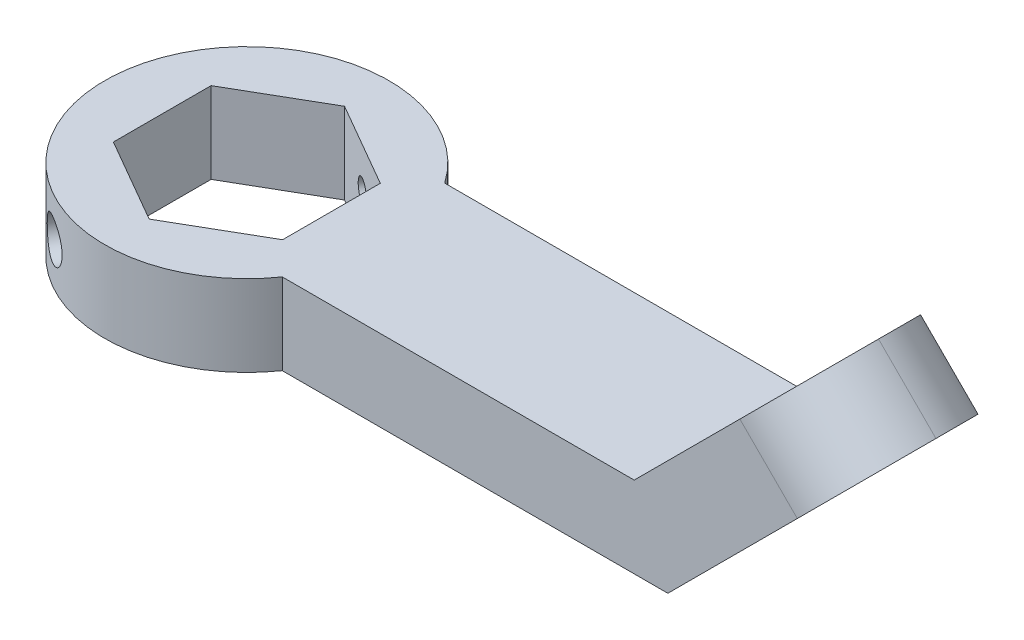
ISO-10303-21;
HEADER;
FILE_DESCRIPTION(('STEP AP214'),'2;1');
FILE_NAME('part.step','',(''),(''),'','','');
FILE_SCHEMA(('AUTOMOTIVE_DESIGN { 1 0 10303 214 1 1 1 1 }'));
ENDSEC;
DATA;
#1=APPLICATION_CONTEXT('core data for automotive mechanical design processes');
#2=APPLICATION_PROTOCOL_DEFINITION('international standard','automotive_design',2000,#1);
#3=PRODUCT_CONTEXT('',#1,'mechanical');
#4=PRODUCT('Part','Part','',(#3));
#5=PRODUCT_RELATED_PRODUCT_CATEGORY('part','',(#4));
#6=PRODUCT_DEFINITION_FORMATION('','',#4);
#7=PRODUCT_DEFINITION_CONTEXT('part definition',#1,'design');
#8=PRODUCT_DEFINITION('design','',#6,#7);
#9=PRODUCT_DEFINITION_SHAPE('','',#8);
#10=(LENGTH_UNIT() NAMED_UNIT(*) SI_UNIT(.MILLI.,.METRE.));
#11=(NAMED_UNIT(*) PLANE_ANGLE_UNIT() SI_UNIT($,.RADIAN.));
#12=(NAMED_UNIT(*) SI_UNIT($,.STERADIAN.) SOLID_ANGLE_UNIT());
#13=UNCERTAINTY_MEASURE_WITH_UNIT(LENGTH_MEASURE(1.E-05),#10,'distance_accuracy_value','');
#14=(GEOMETRIC_REPRESENTATION_CONTEXT(3) GLOBAL_UNCERTAINTY_ASSIGNED_CONTEXT((#13)) GLOBAL_UNIT_ASSIGNED_CONTEXT((#10,
#11,#12)) REPRESENTATION_CONTEXT('',''));
#15=CARTESIAN_POINT('',(0.,0.,0.));
#16=DIRECTION('',(0.,0.,1.));
#17=DIRECTION('',(1.,0.,0.));
#18=AXIS2_PLACEMENT_3D('',#15,#16,#17);
#19=CARTESIAN_POINT('',(0.,12.,0.));
#20=DIRECTION('',(0.,-1.,0.));
#21=DIRECTION('',(0.,0.,-1.));
#22=AXIS2_PLACEMENT_3D('',#19,#20,#21);
#23=CYLINDRICAL_SURFACE('',#22,21.);
#24=CARTESIAN_POINT('',(0.,0.,0.));
#25=DIRECTION('',(0.,1.,0.));
#26=DIRECTION('',(0.,0.,1.));
#27=AXIS2_PLACEMENT_3D('',#24,#25,#26);
#28=CIRCLE('',#27,21.);
#29=CARTESIAN_POINT('',(17.2336879396141,0.,-12.));
#30=VERTEX_POINT('',#29);
#31=CARTESIAN_POINT('',(17.2336879396141,0.,12.));
#32=VERTEX_POINT('',#31);
#33=EDGE_CURVE('E177',#30,#32,#28,.T.);
#34=ORIENTED_EDGE('',*,*,#33,.T.);
#35=DIRECTION('',(0.,-1.,0.));
#36=VECTOR('',#35,1.);
#37=CARTESIAN_POINT('',(17.2336879396141,12.,12.));
#38=LINE('',#37,#36);
#39=CARTESIAN_POINT('',(17.2336879396141,12.,12.));
#40=VERTEX_POINT('',#39);
#41=EDGE_CURVE('E208',#40,#32,#38,.T.);
#42=ORIENTED_EDGE('',*,*,#41,.F.);
#43=CARTESIAN_POINT('',(0.,12.,0.));
#44=DIRECTION('',(0.,1.,0.));
#45=DIRECTION('',(0.,0.,1.));
#46=AXIS2_PLACEMENT_3D('',#43,#44,#45);
#47=CIRCLE('',#46,21.);
#48=CARTESIAN_POINT('',(17.2336879396141,12.,-12.));
#49=VERTEX_POINT('',#48);
#50=EDGE_CURVE('E400',#49,#40,#47,.T.);
#51=ORIENTED_EDGE('',*,*,#50,.F.);
#52=DIRECTION('',(0.,-1.,0.));
#53=VECTOR('',#52,1.);
#54=CARTESIAN_POINT('',(17.2336879396141,12.,-12.));
#55=LINE('',#54,#53);
#56=EDGE_CURVE('E212',#49,#30,#55,.T.);
#57=ORIENTED_EDGE('',*,*,#56,.T.);
#58=EDGE_LOOP('',(#34,#42,#51,#57));
#59=FACE_BOUND('',#58,.T.);
#60=CARTESIAN_POINT('',(12.9903810567666,6.,-16.5));
#61=CARTESIAN_POINT('',(12.9903763522002,6.16758625686065,-16.5000058279724));
#62=CARTESIAN_POINT('',(12.9792031251556,6.33527206915852,-16.5088193193199));
#63=CARTESIAN_POINT('',(12.9347292399679,6.66596195463466,-16.5436860216348));
#64=CARTESIAN_POINT('',(12.9014065311543,6.82896119327265,-16.5697564124092));
#65=CARTESIAN_POINT('',(12.8133946432088,7.14544305004336,-16.6379083743744));
#66=CARTESIAN_POINT('',(12.7587212841242,7.2989326171508,-16.6799780900512));
#67=CARTESIAN_POINT('',(12.6292142856095,7.59223459420206,-16.7782455256741));
#68=CARTESIAN_POINT('',(12.5543836245228,7.73204902056043,-16.8344411583624));
#69=CARTESIAN_POINT('',(12.3856324215908,7.99507244377099,-16.9589842328617));
#70=CARTESIAN_POINT('',(12.2915909301981,8.11816757079883,-17.027408304136));
#71=CARTESIAN_POINT('',(12.0868128884201,8.34327233586087,-17.1733727874205));
#72=CARTESIAN_POINT('',(11.9760754478793,8.44528084896041,-17.2509136854517));
#73=CARTESIAN_POINT('',(11.7399544780285,8.62573364663952,-17.4124664824296));
#74=CARTESIAN_POINT('',(11.6145093757485,8.70407357177765,-17.4965050451331));
#75=CARTESIAN_POINT('',(11.3524726143887,8.83429610299173,-17.6676491217661));
#76=CARTESIAN_POINT('',(11.2158814911104,8.88617997997109,-17.7547544881567));
#77=CARTESIAN_POINT('',(10.9361221970026,8.9616738104464,-17.9284170923675));
#78=CARTESIAN_POINT('',(10.7930052121906,8.98547410494936,-18.0149740186602));
#79=CARTESIAN_POINT('',(10.5033101986708,9.0047158478499,-18.185398215919));
#80=CARTESIAN_POINT('',(10.3567323456795,9.00015873294917,-18.2692656229307));
#81=CARTESIAN_POINT('',(10.0654379600259,8.96296593267628,-18.431346923755));
#82=CARTESIAN_POINT('',(9.92071564632298,8.93053500167624,-18.509597546188));
#83=CARTESIAN_POINT('',(9.6363180769833,8.83883616045119,-18.6592392926156));
#84=CARTESIAN_POINT('',(9.49664294136137,8.7795676125183,-18.7306302535639));
#85=CARTESIAN_POINT('',(9.22607562859843,8.63566388282465,-18.8653776435087));
#86=CARTESIAN_POINT('',(9.09521546135055,8.55094177332174,-18.9287054632184));
#87=CARTESIAN_POINT('',(8.84683001394442,8.35859926088961,-19.0460625304899));
#88=CARTESIAN_POINT('',(8.72930553162801,8.25097748903518,-19.1000912218072));
#89=CARTESIAN_POINT('',(8.5103186419644,8.01474809748602,-19.1986732496745));
#90=CARTESIAN_POINT('',(8.40900890335686,7.88596180087622,-19.2431377418786));
#91=CARTESIAN_POINT('',(8.22708454669562,7.61166821785578,-19.3216181207453));
#92=CARTESIAN_POINT('',(8.14647003467225,7.46616084578158,-19.3556339538751));
#93=CARTESIAN_POINT('',(8.00866780656494,7.16237956514074,-19.4130585875355));
#94=CARTESIAN_POINT('',(7.95149559264746,7.0040972911761,-19.4364603701787));
#95=CARTESIAN_POINT('',(7.8627173357515,6.67935363026117,-19.4725446223238));
#96=CARTESIAN_POINT('',(7.83110966615434,6.51289276441266,-19.4852277738321));
#97=CARTESIAN_POINT('',(7.79479068438033,6.17808519385494,-19.4997852203571));
#98=CARTESIAN_POINT('',(7.78984520991186,6.00976796100663,-19.5017536197985));
#99=CARTESIAN_POINT('',(7.80640325319912,5.67465329246228,-19.4951313063255));
#100=CARTESIAN_POINT('',(7.82790602900677,5.50785581426507,-19.4865408896156));
#101=CARTESIAN_POINT('',(7.89641118919083,5.18128172995733,-19.4588805127899));
#102=CARTESIAN_POINT('',(7.94329839841867,5.02147690940199,-19.4398578810742));
#103=CARTESIAN_POINT('',(8.06083012010523,4.71253680381526,-19.3914165043477));
#104=CARTESIAN_POINT('',(8.13147570470655,4.56340200065742,-19.3619972901679));
#105=CARTESIAN_POINT('',(8.29466956464491,4.27891218041777,-19.292649927897));
#106=CARTESIAN_POINT('',(8.38736456586668,4.14365855818146,-19.2526511704977));
#107=CARTESIAN_POINT('',(8.59131748425676,3.89181041456173,-19.1625067213285));
#108=CARTESIAN_POINT('',(8.70257635064205,3.77521684791131,-19.1123605106659));
#109=CARTESIAN_POINT('',(8.94099044132609,3.5631071723493,-19.0020009732205));
#110=CARTESIAN_POINT('',(9.06825895012815,3.46775621652072,-18.9417147541861));
#111=CARTESIAN_POINT('',(9.33398899456971,3.30198665529642,-18.8121892901971));
#112=CARTESIAN_POINT('',(9.47245024749221,3.23156742039307,-18.7429502713543));
#113=CARTESIAN_POINT('',(9.75577531031314,3.11792682852643,-18.5970462784702));
#114=CARTESIAN_POINT('',(9.90061569708839,3.07461361705877,-18.5204074109428));
#115=CARTESIAN_POINT('',(10.1927295224514,3.01611679934009,-18.3612611778305));
#116=CARTESIAN_POINT('',(10.3400028153842,3.00093151521923,-18.2787541625936));
#117=CARTESIAN_POINT('',(10.6313189345408,2.99915964158329,-18.1108551542123));
#118=CARTESIAN_POINT('',(10.7753788454339,3.01231977147232,-18.0254953658427));
#119=CARTESIAN_POINT('',(11.0575845567149,3.06632422506457,-17.8537703607795));
#120=CARTESIAN_POINT('',(11.1957303710651,3.1071684834059,-17.7674051464603));
#121=CARTESIAN_POINT('',(11.4623743768178,3.21529496614219,-17.5965636525325));
#122=CARTESIAN_POINT('',(11.5908783222135,3.28256127072674,-17.5120862678019));
#123=CARTESIAN_POINT('',(11.8351552583301,3.4415957238034,-17.3479331053389));
#124=CARTESIAN_POINT('',(11.9509279136488,3.53336451758851,-17.2682574541319));
#125=CARTESIAN_POINT('',(12.1679728419662,3.7397215728337,-17.1160213385972));
#126=CARTESIAN_POINT('',(12.2691133493466,3.85449736024364,-17.0435271859353));
#127=CARTESIAN_POINT('',(12.4534496257645,4.10321634035804,-16.9093059795015));
#128=CARTESIAN_POINT('',(12.5366411689557,4.23716403451383,-16.8475814619507));
#129=CARTESIAN_POINT('',(12.6835896171364,4.52121815748725,-16.7372359349803));
#130=CARTESIAN_POINT('',(12.7472458945059,4.67140303555126,-16.6886829168907));
#131=CARTESIAN_POINT('',(12.8530808115054,4.98304844484107,-16.6073119241654));
#132=CARTESIAN_POINT('',(12.8952820679763,5.14449689745894,-16.5744773820171));
#133=CARTESIAN_POINT('',(12.9475957594186,5.42225463875457,-16.5336160362004));
#134=CARTESIAN_POINT('',(12.963621510618,5.53683650311822,-16.5210382305949));
#135=CARTESIAN_POINT('',(12.9850157311465,5.76759629544637,-16.5042282381729));
#136=CARTESIAN_POINT('',(12.990384319516,5.88377420556844,-16.4999959581368));
#137=CARTESIAN_POINT('',(12.9903810567666,6.,-16.5));
#138=B_SPLINE_CURVE_WITH_KNOTS('',3,(#60,#61,#62,#63,#64,#65,#66,#67,#68,#69,#70,#71,#72,#73,
#74,#75,#76,#77,#78,#79,#80,#81,#82,#83,#84,#85,#86,#87,#88,#89,#90,#91,#92,#93,#94,#95,#96,#97,
#98,#99,#100,#101,#102,#103,#104,#105,#106,#107,#108,#109,#110,#111,#112,#113,#114,#115,#116,
#117,#118,#119,#120,#121,#122,#123,#124,#125,#126,#127,#128,#129,#130,#131,#132,#133,#134,#135,
#136,#137),.UNSPECIFIED.,.T.,.F.,(4,2,2,2,2,2,2,2,2,2,2,2,2,2,2,2,2,2,2,2,2,2,2,2,2,2,2,2,2,2,2,
2,2,2,2,2,2,2,4),(0.,0.502334024113459,1.00516889178942,1.50763188209037,2.01002067162461,
2.51567573473529,3.02135776671805,3.52923796014004,4.0370937535653,4.54148733207926,
5.04585535617149,5.54654977361163,6.04725608903567,6.5496922146208,7.05215838391559,
7.55910776979364,8.06605975293416,8.57334643996605,9.08060084686313,9.5833929162384,
10.0861708811986,10.5866865120645,11.0872247326969,11.5911918151719,12.095184674649,
12.6029688228325,13.1107401489249,13.6167813320836,14.1227923282125,14.624300629561,
15.1258077468585,15.6270131584669,16.1282317710298,16.6337152396299,17.1393175880744,
17.6474822327285,18.1551100783564,18.5034967795013,18.8518795891438),.UNSPECIFIED.);
#139=CARTESIAN_POINT('',(12.9903810567666,6.,-16.5));
#140=VERTEX_POINT('',#139);
#141=EDGE_CURVE('E259',#140,#140,#138,.T.);
#142=ORIENTED_EDGE('',*,*,#141,.T.);
#143=EDGE_LOOP('',(#142));
#144=FACE_BOUND('',#143,.T.);
#145=CARTESIAN_POINT('',(-12.9903810567666,6.,16.5));
#146=CARTESIAN_POINT('',(-12.9903763522002,5.83241374313935,16.5000058279724));
#147=CARTESIAN_POINT('',(-12.9792031251556,5.66472793084148,16.5088193193199));
#148=CARTESIAN_POINT('',(-12.9347292399679,5.33403804536534,16.5436860216348));
#149=CARTESIAN_POINT('',(-12.9014065311543,5.17103880672735,16.5697564124092));
#150=CARTESIAN_POINT('',(-12.8133946432088,4.85455694995664,16.6379083743744));
#151=CARTESIAN_POINT('',(-12.7587212841242,4.7010673828492,16.6799780900512));
#152=CARTESIAN_POINT('',(-12.6292142856095,4.40776540579794,16.7782455256741));
#153=CARTESIAN_POINT('',(-12.5543836245228,4.26795097943957,16.8344411583624));
#154=CARTESIAN_POINT('',(-12.3856324215908,4.004927556229,16.9589842328617));
#155=CARTESIAN_POINT('',(-12.2915909301981,3.88183242920117,17.027408304136));
#156=CARTESIAN_POINT('',(-12.0868128884201,3.65672766413913,17.1733727874205));
#157=CARTESIAN_POINT('',(-11.9760754478793,3.55471915103959,17.2509136854517));
#158=CARTESIAN_POINT('',(-11.7399544780285,3.37426635336047,17.4124664824296));
#159=CARTESIAN_POINT('',(-11.6145093757485,3.29592642822235,17.4965050451331));
#160=CARTESIAN_POINT('',(-11.3524726143886,3.16570389700827,17.6676491217661));
#161=CARTESIAN_POINT('',(-11.2158814911104,3.11382002002891,17.7547544881567));
#162=CARTESIAN_POINT('',(-10.9361221970026,3.0383261895536,17.9284170923675));
#163=CARTESIAN_POINT('',(-10.7930052121906,3.01452589505064,18.0149740186602));
#164=CARTESIAN_POINT('',(-10.5033101986708,2.9952841521501,18.185398215919));
#165=CARTESIAN_POINT('',(-10.3567323456795,2.99984126705083,18.2692656229307));
#166=CARTESIAN_POINT('',(-10.0654379600259,3.03703406732372,18.431346923755));
#167=CARTESIAN_POINT('',(-9.92071564632298,3.06946499832376,18.509597546188));
#168=CARTESIAN_POINT('',(-9.63631807698331,3.16116383954881,18.6592392926156));
#169=CARTESIAN_POINT('',(-9.49664294136137,3.22043238748169,18.7306302535639));
#170=CARTESIAN_POINT('',(-9.22607562859844,3.36433611717535,18.8653776435087));
#171=CARTESIAN_POINT('',(-9.09521546135056,3.44905822667826,18.9287054632184));
#172=CARTESIAN_POINT('',(-8.84683001394442,3.64140073911039,19.0460625304899));
#173=CARTESIAN_POINT('',(-8.72930553162801,3.74902251096483,19.1000912218072));
#174=CARTESIAN_POINT('',(-8.5103186419644,3.98525190251399,19.1986732496745));
#175=CARTESIAN_POINT('',(-8.40900890335686,4.11403819912379,19.2431377418786));
#176=CARTESIAN_POINT('',(-8.22708454669562,4.38833178214422,19.3216181207453));
#177=CARTESIAN_POINT('',(-8.14647003467225,4.53383915421842,19.3556339538751));
#178=CARTESIAN_POINT('',(-8.00866780656494,4.83762043485927,19.4130585875355));
#179=CARTESIAN_POINT('',(-7.95149559264746,4.9959027088239,19.4364603701787));
#180=CARTESIAN_POINT('',(-7.8627173357515,5.32064636973883,19.4725446223238));
#181=CARTESIAN_POINT('',(-7.83110966615434,5.48710723558734,19.4852277738321));
#182=CARTESIAN_POINT('',(-7.79479068438033,5.82191480614506,19.4997852203571));
#183=CARTESIAN_POINT('',(-7.78984520991186,5.99023203899337,19.5017536197985));
#184=CARTESIAN_POINT('',(-7.80640325319912,6.32534670753772,19.4951313063255));
#185=CARTESIAN_POINT('',(-7.82790602900677,6.49214418573493,19.4865408896156));
#186=CARTESIAN_POINT('',(-7.89641118919083,6.81871827004267,19.4588805127899));
#187=CARTESIAN_POINT('',(-7.94329839841867,6.97852309059801,19.4398578810742));
#188=CARTESIAN_POINT('',(-8.06083012010523,7.28746319618474,19.3914165043477));
#189=CARTESIAN_POINT('',(-8.13147570470655,7.43659799934258,19.3619972901679));
#190=CARTESIAN_POINT('',(-8.29466956464491,7.72108781958223,19.292649927897));
#191=CARTESIAN_POINT('',(-8.38736456586668,7.85634144181854,19.2526511704977));
#192=CARTESIAN_POINT('',(-8.59131748425676,8.10818958543827,19.1625067213285));
#193=CARTESIAN_POINT('',(-8.70257635064205,8.22478315208869,19.1123605106659));
#194=CARTESIAN_POINT('',(-8.94099044132609,8.4368928276507,19.0020009732205));
#195=CARTESIAN_POINT('',(-9.06825895012815,8.53224378347928,18.9417147541861));
#196=CARTESIAN_POINT('',(-9.33398899456971,8.69801334470358,18.8121892901971));
#197=CARTESIAN_POINT('',(-9.47245024749221,8.76843257960692,18.7429502713543));
#198=CARTESIAN_POINT('',(-9.75577531031314,8.88207317147357,18.5970462784702));
#199=CARTESIAN_POINT('',(-9.9006156970884,8.92538638294123,18.5204074109428));
#200=CARTESIAN_POINT('',(-10.1927295224514,8.98388320065992,18.3612611778305));
#201=CARTESIAN_POINT('',(-10.3400028153842,8.99906848478077,18.2787541625936));
#202=CARTESIAN_POINT('',(-10.6313189345408,9.00084035841671,18.1108551542123));
#203=CARTESIAN_POINT('',(-10.7753788454339,8.98768022852768,18.0254953658427));
#204=CARTESIAN_POINT('',(-11.0575845567149,8.93367577493543,17.8537703607795));
#205=CARTESIAN_POINT('',(-11.1957303710651,8.8928315165941,17.7674051464603));
#206=CARTESIAN_POINT('',(-11.4623743768178,8.78470503385781,17.5965636525325));
#207=CARTESIAN_POINT('',(-11.5908783222135,8.71743872927326,17.5120862678019));
#208=CARTESIAN_POINT('',(-11.8351552583301,8.5584042761966,17.3479331053389));
#209=CARTESIAN_POINT('',(-11.9509279136488,8.46663548241149,17.2682574541319));
#210=CARTESIAN_POINT('',(-12.1679728419662,8.2602784271663,17.1160213385972));
#211=CARTESIAN_POINT('',(-12.2691133493466,8.14550263975636,17.0435271859353));
#212=CARTESIAN_POINT('',(-12.4534496257645,7.89678365964195,16.9093059795015));
#213=CARTESIAN_POINT('',(-12.5366411689557,7.76283596548617,16.8475814619507));
#214=CARTESIAN_POINT('',(-12.6835896171364,7.47878184251275,16.7372359349803));
#215=CARTESIAN_POINT('',(-12.7472458945059,7.32859696444874,16.6886829168907));
#216=CARTESIAN_POINT('',(-12.8530808115054,7.01695155515893,16.6073119241654));
#217=CARTESIAN_POINT('',(-12.8952820679763,6.85550310254106,16.5744773820171));
#218=CARTESIAN_POINT('',(-12.9475957594186,6.57774536124543,16.5336160362004));
#219=CARTESIAN_POINT('',(-12.963621510618,6.46316349688178,16.5210382305949));
#220=CARTESIAN_POINT('',(-12.9850157311465,6.23240370455363,16.5042282381729));
#221=CARTESIAN_POINT('',(-12.990384319516,6.11622579443156,16.4999959581368));
#222=CARTESIAN_POINT('',(-12.9903810567666,6.,16.5));
#223=B_SPLINE_CURVE_WITH_KNOTS('',3,(#145,#146,#147,#148,#149,#150,#151,#152,#153,#154,#155,
#156,#157,#158,#159,#160,#161,#162,#163,#164,#165,#166,#167,#168,#169,#170,#171,#172,#173,#174,
#175,#176,#177,#178,#179,#180,#181,#182,#183,#184,#185,#186,#187,#188,#189,#190,#191,#192,#193,
#194,#195,#196,#197,#198,#199,#200,#201,#202,#203,#204,#205,#206,#207,#208,#209,#210,#211,#212,
#213,#214,#215,#216,#217,#218,#219,#220,#221,#222),.UNSPECIFIED.,.T.,.F.,(4,2,2,2,2,2,2,2,2,2,2,
2,2,2,2,2,2,2,2,2,2,2,2,2,2,2,2,2,2,2,2,2,2,2,2,2,2,2,4),(0.,0.50233402411346,1.00516889178942,
1.50763188209038,2.01002067162461,2.51567573473529,3.02135776671806,3.52923796014005,
4.0370937535653,4.54148733207927,5.04585535617149,5.54654977361162,6.04725608903567,
6.5496922146208,7.05215838391559,7.55910776979364,8.06605975293417,8.57334643996605,
9.08060084686313,9.5833929162384,10.0861708811986,10.5866865120645,11.0872247326969,
11.5911918151719,12.095184674649,12.6029688228325,13.1107401489249,13.6167813320836,
14.1227923282125,14.624300629561,15.1258077468585,15.6270131584669,16.1282317710298,
16.6337152396299,17.1393175880744,17.6474822327285,18.1551100783564,18.5034967795013,
18.8518795891438),.UNSPECIFIED.);
#224=CARTESIAN_POINT('',(-12.9903810567666,6.,16.5));
#225=VERTEX_POINT('',#224);
#226=EDGE_CURVE('E71',#225,#225,#223,.T.);
#227=ORIENTED_EDGE('',*,*,#226,.F.);
#228=EDGE_LOOP('',(#227));
#229=FACE_BOUND('',#228,.T.);
#230=ADVANCED_FACE('F67',(#59,#144,#229),#23,.T.);
#231=CARTESIAN_POINT('',(82.0147186257614,24.7852813742385,0.));
#232=DIRECTION('',(0.707106781186549,-0.707106781186546,0.));
#233=DIRECTION('',(0.707106781186546,0.707106781186549,0.));
#234=AXIS2_PLACEMENT_3D('',#231,#232,#233);
#235=CYLINDRICAL_SURFACE('',#234,4.);
#236=CARTESIAN_POINT('',(82.0147186257614,24.7852813742385,0.));
#237=DIRECTION('',(0.707106781186549,-0.707106781186546,0.));
#238=DIRECTION('',(0.707106781186546,0.707106781186549,0.));
#239=AXIS2_PLACEMENT_3D('',#236,#237,#238);
#240=CIRCLE('',#239,4.);
#241=CARTESIAN_POINT('',(84.8431457505076,27.6137084989847,0.));
#242=VERTEX_POINT('',#241);
#243=EDGE_CURVE('E192',#242,#242,#240,.T.);
#244=ORIENTED_EDGE('',*,*,#243,.F.);
#245=EDGE_LOOP('',(#244));
#246=FACE_BOUND('',#245,.T.);
#247=CARTESIAN_POINT('',(86.8584000768893,19.9415999231107,0.));
#248=DIRECTION('',(0.707106781186549,-0.707106781186546,0.));
#249=DIRECTION('',(0.707106781186546,0.707106781186549,0.));
#250=AXIS2_PLACEMENT_3D('',#247,#248,#249);
#251=CIRCLE('',#250,4.);
#252=CARTESIAN_POINT('',(89.6868272016355,22.7700270478569,0.));
#253=VERTEX_POINT('',#252);
#254=EDGE_CURVE('E253',#253,#253,#251,.T.);
#255=ORIENTED_EDGE('',*,*,#254,.T.);
#256=EDGE_LOOP('',(#255));
#257=FACE_BOUND('',#256,.T.);
#258=ADVANCED_FACE('F292',(#246,#257),#235,.F.);
#259=CARTESIAN_POINT('',(0.,12.,0.));
#260=DIRECTION('',(0.,1.,0.));
#261=DIRECTION('',(0.,0.,1.));
#262=AXIS2_PLACEMENT_3D('',#259,#260,#261);
#263=PLANE('',#262);
#264=DIRECTION('',(-0.866025403784439,0.,0.5));
#265=VECTOR('',#264,1.);
#266=CARTESIAN_POINT('',(-6.25,12.,-10.8253175473055));
#267=LINE('',#266,#265);
#268=CARTESIAN_POINT('',(0.,12.,-14.4337567297406));
#269=VERTEX_POINT('',#268);
#270=CARTESIAN_POINT('',(-12.5,12.,-7.21687836487033));
#271=VERTEX_POINT('',#270);
#272=EDGE_CURVE('E197',#269,#271,#267,.T.);
#273=ORIENTED_EDGE('',*,*,#272,.F.);
#274=DIRECTION('',(-0.866025403784439,0.,-0.5));
#275=VECTOR('',#274,1.);
#276=CARTESIAN_POINT('',(6.25,12.,-10.8253175473055));
#277=LINE('',#276,#275);
#278=CARTESIAN_POINT('',(12.5,12.,-7.21687836487033));
#279=VERTEX_POINT('',#278);
#280=EDGE_CURVE('E203',#279,#269,#277,.T.);
#281=ORIENTED_EDGE('',*,*,#280,.F.);
#282=DIRECTION('',(0.,0.,-1.));
#283=VECTOR('',#282,1.);
#284=CARTESIAN_POINT('',(12.5,12.,0.));
#285=LINE('',#284,#283);
#286=CARTESIAN_POINT('',(12.5,12.,7.21687836487033));
#287=VERTEX_POINT('',#286);
#288=EDGE_CURVE('E380',#287,#279,#285,.T.);
#289=ORIENTED_EDGE('',*,*,#288,.F.);
#290=DIRECTION('',(0.866025403784439,0.,-0.5));
#291=VECTOR('',#290,1.);
#292=CARTESIAN_POINT('',(6.25,12.,10.8253175473055));
#293=LINE('',#292,#291);
#294=CARTESIAN_POINT('',(0.,12.,14.4337567297406));
#295=VERTEX_POINT('',#294);
#296=EDGE_CURVE('E384',#295,#287,#293,.T.);
#297=ORIENTED_EDGE('',*,*,#296,.F.);
#298=DIRECTION('',(0.866025403784439,0.,0.5));
#299=VECTOR('',#298,1.);
#300=CARTESIAN_POINT('',(-6.25,12.,10.8253175473055));
#301=LINE('',#300,#299);
#302=CARTESIAN_POINT('',(-12.5,12.,7.21687836487032));
#303=VERTEX_POINT('',#302);
#304=EDGE_CURVE('E388',#303,#295,#301,.T.);
#305=ORIENTED_EDGE('',*,*,#304,.F.);
#306=DIRECTION('',(0.,0.,1.));
#307=VECTOR('',#306,1.);
#308=CARTESIAN_POINT('',(-12.5,12.,0.));
#309=LINE('',#308,#307);
#310=EDGE_CURVE('E392',#271,#303,#309,.T.);
#311=ORIENTED_EDGE('',*,*,#310,.F.);
#312=EDGE_LOOP('',(#273,#281,#289,#297,#305,#311));
#313=FACE_BOUND('',#312,.T.);
#314=DIRECTION('',(1.,0.,0.));
#315=VECTOR('',#314,1.);
#316=CARTESIAN_POINT('',(0.,12.,12.));
#317=LINE('',#316,#315);
#318=CARTESIAN_POINT('',(69.2294372515229,12.,12.));
#319=VERTEX_POINT('',#318);
#320=EDGE_CURVE('E221',#40,#319,#317,.T.);
#321=ORIENTED_EDGE('',*,*,#320,.T.);
#322=DIRECTION('',(0.,0.,-1.));
#323=VECTOR('',#322,1.);
#324=CARTESIAN_POINT('',(69.2294372515229,12.,0.));
#325=LINE('',#324,#323);
#326=CARTESIAN_POINT('',(69.2294372515229,12.,-12.));
#327=VERTEX_POINT('',#326);
#328=EDGE_CURVE('E216',#319,#327,#325,.T.);
#329=ORIENTED_EDGE('',*,*,#328,.T.);
#330=DIRECTION('',(1.,0.,0.));
#331=VECTOR('',#330,1.);
#332=CARTESIAN_POINT('',(0.,12.,-12.));
#333=LINE('',#332,#331);
#334=EDGE_CURVE('E396',#49,#327,#333,.T.);
#335=ORIENTED_EDGE('',*,*,#334,.F.);
#336=ORIENTED_EDGE('',*,*,#50,.T.);
#337=EDGE_LOOP('',(#321,#329,#335,#336));
#338=FACE_BOUND('',#337,.T.);
#339=ADVANCED_FACE('F295',(#313,#338),#263,.T.);
#340=CARTESIAN_POINT('',(0.,12.,-12.));
#341=DIRECTION('',(0.,0.,-1.));
#342=DIRECTION('',(-1.,0.,0.));
#343=AXIS2_PLACEMENT_3D('',#340,#341,#342);
#344=PLANE('',#343);
#345=DIRECTION('',(0.707106781186546,0.707106781186549,0.));
#346=VECTOR('',#345,1.);
#347=CARTESIAN_POINT('',(65.7147186257615,8.48528137423854,-12.));
#348=LINE('',#347,#346);
#349=CARTESIAN_POINT('',(84.8431457505076,27.6137084989847,-12.));
#350=VERTEX_POINT('',#349);
#351=EDGE_CURVE('E368',#327,#350,#348,.T.);
#352=ORIENTED_EDGE('',*,*,#351,.T.);
#353=DIRECTION('',(0.707106781186549,-0.707106781186546,0.));
#354=VECTOR('',#353,1.);
#355=CARTESIAN_POINT('',(93.3284271247462,19.1284271247462,-12.));
#356=LINE('',#355,#354);
#357=CARTESIAN_POINT('',(93.3284271247462,19.1284271247462,-12.));
#358=VERTEX_POINT('',#357);
#359=EDGE_CURVE('E188',#350,#358,#356,.T.);
#360=ORIENTED_EDGE('',*,*,#359,.T.);
#361=DIRECTION('',(0.707106781186546,0.707106781186549,0.));
#362=VECTOR('',#361,1.);
#363=CARTESIAN_POINT('',(74.2000000000001,0.,-12.));
#364=LINE('',#363,#362);
#365=CARTESIAN_POINT('',(74.2000000000001,0.,-12.));
#366=VERTEX_POINT('',#365);
#367=EDGE_CURVE('E184',#366,#358,#364,.T.);
#368=ORIENTED_EDGE('',*,*,#367,.F.);
#369=DIRECTION('',(1.,0.,0.));
#370=VECTOR('',#369,1.);
#371=CARTESIAN_POINT('',(0.,0.,-12.));
#372=LINE('',#371,#370);
#373=EDGE_CURVE('E170',#30,#366,#372,.T.);
#374=ORIENTED_EDGE('',*,*,#373,.F.);
#375=ORIENTED_EDGE('',*,*,#56,.F.);
#376=ORIENTED_EDGE('',*,*,#334,.T.);
#377=EDGE_LOOP('',(#352,#360,#368,#374,#375,#376));
#378=FACE_BOUND('',#377,.T.);
#379=ADVANCED_FACE('F186',(#378),#344,.T.);
#380=CARTESIAN_POINT('',(0.,12.,12.));
#381=DIRECTION('',(0.,0.,-1.));
#382=DIRECTION('',(-1.,0.,0.));
#383=AXIS2_PLACEMENT_3D('',#380,#381,#382);
#384=PLANE('',#383);
#385=DIRECTION('',(0.707106781186546,0.707106781186549,0.));
#386=VECTOR('',#385,1.);
#387=CARTESIAN_POINT('',(74.2000000000001,0.,12.));
#388=LINE('',#387,#386);
#389=CARTESIAN_POINT('',(74.2000000000001,0.,12.));
#390=VERTEX_POINT('',#389);
#391=CARTESIAN_POINT('',(93.3284271247462,19.1284271247462,12.));
#392=VERTEX_POINT('',#391);
#393=EDGE_CURVE('E191',#390,#392,#388,.T.);
#394=ORIENTED_EDGE('',*,*,#393,.T.);
#395=DIRECTION('',(0.707106781186549,-0.707106781186546,0.));
#396=VECTOR('',#395,1.);
#397=CARTESIAN_POINT('',(50.228427124746,62.2284271247462,12.));
#398=LINE('',#397,#396);
#399=CARTESIAN_POINT('',(84.8431457505076,27.6137084989847,12.));
#400=VERTEX_POINT('',#399);
#401=EDGE_CURVE('E12',#392,#400,#398,.F.);
#402=ORIENTED_EDGE('',*,*,#401,.T.);
#403=DIRECTION('',(0.707106781186546,0.707106781186549,0.));
#404=VECTOR('',#403,1.);
#405=CARTESIAN_POINT('',(65.7147186257615,8.48528137423854,12.));
#406=LINE('',#405,#404);
#407=EDGE_CURVE('E371',#319,#400,#406,.T.);
#408=ORIENTED_EDGE('',*,*,#407,.F.);
#409=ORIENTED_EDGE('',*,*,#320,.F.);
#410=ORIENTED_EDGE('',*,*,#41,.T.);
#411=DIRECTION('',(1.,0.,0.));
#412=VECTOR('',#411,1.);
#413=CARTESIAN_POINT('',(0.,0.,12.));
#414=LINE('',#413,#412);
#415=EDGE_CURVE('E198',#32,#390,#414,.T.);
#416=ORIENTED_EDGE('',*,*,#415,.T.);
#417=EDGE_LOOP('',(#394,#402,#408,#409,#410,#416));
#418=FACE_BOUND('',#417,.T.);
#419=ADVANCED_FACE('F309',(#418),#384,.F.);
#420=CARTESIAN_POINT('',(-6.25,12.,-10.8253175473055));
#421=DIRECTION('',(0.5,0.,0.866025403784439));
#422=DIRECTION('',(0.866025403784439,0.,-0.5));
#423=AXIS2_PLACEMENT_3D('',#420,#421,#422);
#424=PLANE('',#423);
#425=DIRECTION('',(-0.866025403784439,0.,0.5));
#426=VECTOR('',#425,1.);
#427=CARTESIAN_POINT('',(-6.25,0.,-10.8253175473055));
#428=LINE('',#427,#426);
#429=CARTESIAN_POINT('',(0.,0.,-14.4337567297406));
#430=VERTEX_POINT('',#429);
#431=CARTESIAN_POINT('',(-12.5,0.,-7.21687836487033));
#432=VERTEX_POINT('',#431);
#433=EDGE_CURVE('E373',#430,#432,#428,.T.);
#434=ORIENTED_EDGE('',*,*,#433,.F.);
#435=DIRECTION('',(0.,-1.,0.));
#436=VECTOR('',#435,1.);
#437=CARTESIAN_POINT('',(0.,12.,-14.4337567297406));
#438=LINE('',#437,#436);
#439=EDGE_CURVE('E213',#269,#430,#438,.T.);
#440=ORIENTED_EDGE('',*,*,#439,.F.);
#441=ORIENTED_EDGE('',*,*,#272,.T.);
#442=DIRECTION('',(0.,-1.,0.));
#443=VECTOR('',#442,1.);
#444=CARTESIAN_POINT('',(-12.5,12.,-7.21687836487033));
#445=LINE('',#444,#443);
#446=EDGE_CURVE('E217',#271,#432,#445,.T.);
#447=ORIENTED_EDGE('',*,*,#446,.T.);
#448=EDGE_LOOP('',(#434,#440,#441,#447));
#449=FACE_BOUND('',#448,.T.);
#450=ADVANCED_FACE('F311',(#449),#424,.T.);
#451=CARTESIAN_POINT('',(6.25,12.,-10.8253175473055));
#452=DIRECTION('',(-0.5,0.,0.866025403784439));
#453=DIRECTION('',(0.866025403784439,0.,0.5));
#454=AXIS2_PLACEMENT_3D('',#451,#452,#453);
#455=PLANE('',#454);
#456=CARTESIAN_POINT('',(6.25,6.,-10.8253175473055));
#457=DIRECTION('',(-0.5,0.,0.866025403784439));
#458=DIRECTION('',(0.866025403784439,0.,0.5));
#459=AXIS2_PLACEMENT_3D('',#456,#457,#458);
#460=CIRCLE('',#459,1.7);
#461=CARTESIAN_POINT('',(7.72224318643355,6.,-9.97531754730549));
#462=VERTEX_POINT('',#461);
#463=EDGE_CURVE('E254',#462,#462,#460,.T.);
#464=ORIENTED_EDGE('',*,*,#463,.F.);
#465=EDGE_LOOP('',(#464));
#466=FACE_BOUND('',#465,.T.);
#467=DIRECTION('',(-0.866025403784439,0.,-0.5));
#468=VECTOR('',#467,1.);
#469=CARTESIAN_POINT('',(6.25,0.,-10.8253175473055));
#470=LINE('',#469,#468);
#471=CARTESIAN_POINT('',(12.5,0.,-7.21687836487033));
#472=VERTEX_POINT('',#471);
#473=EDGE_CURVE('E409',#472,#430,#470,.T.);
#474=ORIENTED_EDGE('',*,*,#473,.F.);
#475=DIRECTION('',(0.,-1.,0.));
#476=VECTOR('',#475,1.);
#477=CARTESIAN_POINT('',(12.5,12.,-7.21687836487033));
#478=LINE('',#477,#476);
#479=EDGE_CURVE('E230',#279,#472,#478,.T.);
#480=ORIENTED_EDGE('',*,*,#479,.F.);
#481=ORIENTED_EDGE('',*,*,#280,.T.);
#482=ORIENTED_EDGE('',*,*,#439,.T.);
#483=EDGE_LOOP('',(#474,#480,#481,#482));
#484=FACE_BOUND('',#483,.T.);
#485=ADVANCED_FACE('F316',(#466,#484),#455,.T.);
#486=CARTESIAN_POINT('',(12.5,12.,0.));
#487=DIRECTION('',(-1.,0.,0.));
#488=DIRECTION('',(0.,0.,1.));
#489=AXIS2_PLACEMENT_3D('',#486,#487,#488);
#490=PLANE('',#489);
#491=DIRECTION('',(0.,0.,-1.));
#492=VECTOR('',#491,1.);
#493=CARTESIAN_POINT('',(12.5,0.,0.));
#494=LINE('',#493,#492);
#495=CARTESIAN_POINT('',(12.5,0.,7.21687836487033));
#496=VERTEX_POINT('',#495);
#497=EDGE_CURVE('E413',#496,#472,#494,.T.);
#498=ORIENTED_EDGE('',*,*,#497,.F.);
#499=DIRECTION('',(0.,-1.,0.));
#500=VECTOR('',#499,1.);
#501=CARTESIAN_POINT('',(12.5,12.,7.21687836487033));
#502=LINE('',#501,#500);
#503=EDGE_CURVE('E227',#287,#496,#502,.T.);
#504=ORIENTED_EDGE('',*,*,#503,.F.);
#505=ORIENTED_EDGE('',*,*,#288,.T.);
#506=ORIENTED_EDGE('',*,*,#479,.T.);
#507=EDGE_LOOP('',(#498,#504,#505,#506));
#508=FACE_BOUND('',#507,.T.);
#509=ADVANCED_FACE('F443',(#508),#490,.T.);
#510=CARTESIAN_POINT('',(6.25,12.,10.8253175473055));
#511=DIRECTION('',(-0.5,0.,-0.866025403784439));
#512=DIRECTION('',(-0.866025403784439,0.,0.5));
#513=AXIS2_PLACEMENT_3D('',#510,#511,#512);
#514=PLANE('',#513);
#515=DIRECTION('',(0.866025403784439,0.,-0.5));
#516=VECTOR('',#515,1.);
#517=CARTESIAN_POINT('',(6.25,0.,10.8253175473055));
#518=LINE('',#517,#516);
#519=CARTESIAN_POINT('',(0.,0.,14.4337567297406));
#520=VERTEX_POINT('',#519);
#521=EDGE_CURVE('E417',#520,#496,#518,.T.);
#522=ORIENTED_EDGE('',*,*,#521,.F.);
#523=DIRECTION('',(0.,-1.,0.));
#524=VECTOR('',#523,1.);
#525=CARTESIAN_POINT('',(0.,12.,14.4337567297406));
#526=LINE('',#525,#524);
#527=EDGE_CURVE('E224',#295,#520,#526,.T.);
#528=ORIENTED_EDGE('',*,*,#527,.F.);
#529=ORIENTED_EDGE('',*,*,#296,.T.);
#530=ORIENTED_EDGE('',*,*,#503,.T.);
#531=EDGE_LOOP('',(#522,#528,#529,#530));
#532=FACE_BOUND('',#531,.T.);
#533=ADVANCED_FACE('F439',(#532),#514,.T.);
#534=CARTESIAN_POINT('',(-6.25,12.,10.8253175473055));
#535=DIRECTION('',(0.5,0.,-0.866025403784438));
#536=DIRECTION('',(-0.866025403784439,0.,-0.5));
#537=AXIS2_PLACEMENT_3D('',#534,#535,#536);
#538=PLANE('',#537);
#539=CARTESIAN_POINT('',(-6.25000000000001,6.,10.8253175473055));
#540=DIRECTION('',(-0.5,0.,0.866025403784439));
#541=DIRECTION('',(0.866025403784438,0.,0.5));
#542=AXIS2_PLACEMENT_3D('',#539,#540,#541);
#543=CIRCLE('',#542,1.7);
#544=CARTESIAN_POINT('',(-4.77775681356646,6.,11.6753175473055));
#545=VERTEX_POINT('',#544);
#546=EDGE_CURVE('E333',#545,#545,#543,.T.);
#547=ORIENTED_EDGE('',*,*,#546,.T.);
#548=EDGE_LOOP('',(#547));
#549=FACE_BOUND('',#548,.T.);
#550=DIRECTION('',(0.866025403784439,0.,0.5));
#551=VECTOR('',#550,1.);
#552=CARTESIAN_POINT('',(-6.25,0.,10.8253175473055));
#553=LINE('',#552,#551);
#554=CARTESIAN_POINT('',(-12.5,0.,7.21687836487032));
#555=VERTEX_POINT('',#554);
#556=EDGE_CURVE('E421',#555,#520,#553,.T.);
#557=ORIENTED_EDGE('',*,*,#556,.F.);
#558=DIRECTION('',(0.,-1.,0.));
#559=VECTOR('',#558,1.);
#560=CARTESIAN_POINT('',(-12.5,12.,7.21687836487032));
#561=LINE('',#560,#559);
#562=EDGE_CURVE('E220',#303,#555,#561,.T.);
#563=ORIENTED_EDGE('',*,*,#562,.F.);
#564=ORIENTED_EDGE('',*,*,#304,.T.);
#565=ORIENTED_EDGE('',*,*,#527,.T.);
#566=EDGE_LOOP('',(#557,#563,#564,#565));
#567=FACE_BOUND('',#566,.T.);
#568=ADVANCED_FACE('F435',(#549,#567),#538,.T.);
#569=CARTESIAN_POINT('',(-12.5,12.,0.));
#570=DIRECTION('',(1.,0.,0.));
#571=DIRECTION('',(0.,0.,-1.));
#572=AXIS2_PLACEMENT_3D('',#569,#570,#571);
#573=PLANE('',#572);
#574=DIRECTION('',(0.,0.,1.));
#575=VECTOR('',#574,1.);
#576=CARTESIAN_POINT('',(-12.5,0.,0.));
#577=LINE('',#576,#575);
#578=EDGE_CURVE('E180',#432,#555,#577,.T.);
#579=ORIENTED_EDGE('',*,*,#578,.F.);
#580=ORIENTED_EDGE('',*,*,#446,.F.);
#581=ORIENTED_EDGE('',*,*,#310,.T.);
#582=ORIENTED_EDGE('',*,*,#562,.T.);
#583=EDGE_LOOP('',(#579,#580,#581,#582));
#584=FACE_BOUND('',#583,.T.);
#585=ADVANCED_FACE('F307',(#584),#573,.T.);
#586=CARTESIAN_POINT('',(0.,0.,0.));
#587=DIRECTION('',(0.,1.,0.));
#588=DIRECTION('',(0.,0.,1.));
#589=AXIS2_PLACEMENT_3D('',#586,#587,#588);
#590=PLANE('',#589);
#591=ORIENTED_EDGE('',*,*,#433,.T.);
#592=ORIENTED_EDGE('',*,*,#578,.T.);
#593=ORIENTED_EDGE('',*,*,#556,.T.);
#594=ORIENTED_EDGE('',*,*,#521,.T.);
#595=ORIENTED_EDGE('',*,*,#497,.T.);
#596=ORIENTED_EDGE('',*,*,#473,.T.);
#597=EDGE_LOOP('',(#591,#592,#593,#594,#595,#596));
#598=FACE_BOUND('',#597,.T.);
#599=ORIENTED_EDGE('',*,*,#373,.T.);
#600=DIRECTION('',(0.,0.,-1.));
#601=VECTOR('',#600,1.);
#602=CARTESIAN_POINT('',(74.2000000000001,0.,0.));
#603=LINE('',#602,#601);
#604=EDGE_CURVE('E174',#390,#366,#603,.T.);
#605=ORIENTED_EDGE('',*,*,#604,.F.);
#606=ORIENTED_EDGE('',*,*,#415,.F.);
#607=ORIENTED_EDGE('',*,*,#33,.F.);
#608=EDGE_LOOP('',(#599,#605,#606,#607));
#609=FACE_BOUND('',#608,.T.);
#610=ADVANCED_FACE('F172',(#598,#609),#590,.F.);
#611=CARTESIAN_POINT('',(28.6147186257616,-28.6147186257615,0.));
#612=DIRECTION('',(0.707106781186549,-0.707106781186546,0.));
#613=DIRECTION('',(0.707106781186546,0.707106781186549,0.));
#614=AXIS2_PLACEMENT_3D('',#611,#612,#613);
#615=PLANE('',#614);
#616=CARTESIAN_POINT('',(84.8431457505076,27.6137084989847,0.));
#617=DIRECTION('',(0.707106781186549,-0.707106781186546,0.));
#618=DIRECTION('',(0.707106781186546,0.707106781186549,0.));
#619=AXIS2_PLACEMENT_3D('',#616,#617,#618);
#620=CIRCLE('',#619,12.);
#621=CARTESIAN_POINT('',(93.3284271247462,36.0989898732233,0.));
#622=VERTEX_POINT('',#621);
#623=EDGE_CURVE('E90',#400,#622,#620,.F.);
#624=ORIENTED_EDGE('',*,*,#623,.T.);
#625=CARTESIAN_POINT('',(84.8431457505076,27.6137084989847,0.));
#626=DIRECTION('',(0.707106781186549,-0.707106781186546,0.));
#627=DIRECTION('',(0.707106781186546,0.707106781186549,0.));
#628=AXIS2_PLACEMENT_3D('',#625,#626,#627);
#629=CIRCLE('',#628,12.);
#630=EDGE_CURVE('E82',#622,#350,#629,.F.);
#631=ORIENTED_EDGE('',*,*,#630,.T.);
#632=ORIENTED_EDGE('',*,*,#351,.F.);
#633=ORIENTED_EDGE('',*,*,#328,.F.);
#634=ORIENTED_EDGE('',*,*,#407,.T.);
#635=EDGE_LOOP('',(#624,#631,#632,#633,#634));
#636=FACE_BOUND('',#635,.T.);
#637=ORIENTED_EDGE('',*,*,#243,.T.);
#638=EDGE_LOOP('',(#637));
#639=FACE_BOUND('',#638,.T.);
#640=ADVANCED_FACE('F297',(#636,#639),#615,.F.);
#641=CARTESIAN_POINT('',(37.1000000000002,-37.1000000000001,0.));
#642=DIRECTION('',(0.707106781186549,-0.707106781186546,0.));
#643=DIRECTION('',(0.707106781186546,0.707106781186549,0.));
#644=AXIS2_PLACEMENT_3D('',#641,#642,#643);
#645=PLANE('',#644);
#646=CARTESIAN_POINT('',(90.5,16.3,0.));
#647=DIRECTION('',(0.707106781186549,-0.707106781186546,0.));
#648=DIRECTION('',(0.707106781186546,0.707106781186549,0.));
#649=AXIS2_PLACEMENT_3D('',#646,#647,#648);
#650=CIRCLE('',#649,7.99999999999999);
#651=CARTESIAN_POINT('',(96.1568542494924,21.9568542494924,0.));
#652=VERTEX_POINT('',#651);
#653=EDGE_CURVE('E357',#652,#652,#650,.T.);
#654=ORIENTED_EDGE('',*,*,#653,.F.);
#655=EDGE_LOOP('',(#654));
#656=FACE_BOUND('',#655,.T.);
#657=ORIENTED_EDGE('',*,*,#367,.T.);
#658=CARTESIAN_POINT('',(93.3284271247462,19.1284271247462,0.));
#659=DIRECTION('',(0.707106781186549,-0.707106781186546,0.));
#660=DIRECTION('',(0.707106781186546,0.707106781186549,0.));
#661=AXIS2_PLACEMENT_3D('',#658,#659,#660);
#662=CIRCLE('',#661,12.);
#663=CARTESIAN_POINT('',(101.813708498985,27.6137084989848,0.));
#664=VERTEX_POINT('',#663);
#665=EDGE_CURVE('E242',#358,#664,#662,.T.);
#666=ORIENTED_EDGE('',*,*,#665,.T.);
#667=CARTESIAN_POINT('',(93.3284271247462,19.1284271247462,0.));
#668=DIRECTION('',(0.707106781186549,-0.707106781186546,0.));
#669=DIRECTION('',(0.707106781186546,0.707106781186549,0.));
#670=AXIS2_PLACEMENT_3D('',#667,#668,#669);
#671=CIRCLE('',#670,12.);
#672=EDGE_CURVE('E239',#664,#392,#671,.T.);
#673=ORIENTED_EDGE('',*,*,#672,.T.);
#674=ORIENTED_EDGE('',*,*,#393,.F.);
#675=ORIENTED_EDGE('',*,*,#604,.T.);
#676=EDGE_LOOP('',(#657,#666,#673,#674,#675));
#677=FACE_BOUND('',#676,.T.);
#678=ADVANCED_FACE('F195',(#656,#677),#645,.T.);
#679=CARTESIAN_POINT('',(86.8584000768893,19.9415999231107,0.));
#680=DIRECTION('',(0.707106781186549,-0.707106781186546,0.));
#681=DIRECTION('',(0.707106781186546,0.707106781186549,0.));
#682=AXIS2_PLACEMENT_3D('',#679,#680,#681);
#683=CYLINDRICAL_SURFACE('',#682,7.99999999999999);
#684=CARTESIAN_POINT('',(86.8584000768893,19.9415999231107,0.));
#685=DIRECTION('',(0.707106781186549,-0.707106781186546,0.));
#686=DIRECTION('',(0.707106781186546,0.707106781186549,0.));
#687=AXIS2_PLACEMENT_3D('',#684,#685,#686);
#688=CIRCLE('',#687,7.99999999999999);
#689=CARTESIAN_POINT('',(92.5152543263816,25.5984541726031,0.));
#690=VERTEX_POINT('',#689);
#691=EDGE_CURVE('E358',#690,#690,#688,.T.);
#692=ORIENTED_EDGE('',*,*,#691,.F.);
#693=EDGE_LOOP('',(#692));
#694=FACE_BOUND('',#693,.T.);
#695=ORIENTED_EDGE('',*,*,#653,.T.);
#696=EDGE_LOOP('',(#695));
#697=FACE_BOUND('',#696,.T.);
#698=ADVANCED_FACE('F287',(#694,#697),#683,.F.);
#699=CARTESIAN_POINT('',(86.8584000768893,19.9415999231107,0.));
#700=DIRECTION('',(0.707106781186549,-0.707106781186546,0.));
#701=DIRECTION('',(0.707106781186546,0.707106781186549,0.));
#702=AXIS2_PLACEMENT_3D('',#699,#700,#701);
#703=PLANE('',#702);
#704=ORIENTED_EDGE('',*,*,#254,.F.);
#705=EDGE_LOOP('',(#704));
#706=FACE_BOUND('',#705,.T.);
#707=ORIENTED_EDGE('',*,*,#691,.T.);
#708=EDGE_LOOP('',(#707));
#709=FACE_BOUND('',#708,.T.);
#710=ADVANCED_FACE('F284',(#706,#709),#703,.T.);
#711=CARTESIAN_POINT('',(84.8431457505076,27.6137084989847,0.));
#712=DIRECTION('',(0.707106781186549,-0.707106781186546,0.));
#713=DIRECTION('',(0.707106781186546,0.707106781186549,0.));
#714=AXIS2_PLACEMENT_3D('',#711,#712,#713);
#715=CYLINDRICAL_SURFACE('',#714,12.);
#716=DIRECTION('',(0.707106781186549,-0.707106781186546,0.));
#717=VECTOR('',#716,1.);
#718=CARTESIAN_POINT('',(93.3284271247462,36.0989898732233,0.));
#719=LINE('',#718,#717);
#720=EDGE_CURVE('E249',#622,#664,#719,.T.);
#721=ORIENTED_EDGE('',*,*,#720,.F.);
#722=ORIENTED_EDGE('',*,*,#623,.F.);
#723=ORIENTED_EDGE('',*,*,#401,.F.);
#724=ORIENTED_EDGE('',*,*,#672,.F.);
#725=EDGE_LOOP('',(#721,#722,#723,#724));
#726=FACE_BOUND('',#725,.T.);
#727=ADVANCED_FACE('F69',(#726),#715,.T.);
#728=CARTESIAN_POINT('',(50.228427124746,62.2284271247462,0.));
#729=DIRECTION('',(-0.707106781186549,0.707106781186546,0.));
#730=DIRECTION('',(-0.707106781186546,-0.707106781186549,0.));
#731=AXIS2_PLACEMENT_3D('',#728,#729,#730);
#732=CYLINDRICAL_SURFACE('',#731,12.);
#733=ORIENTED_EDGE('',*,*,#630,.F.);
#734=ORIENTED_EDGE('',*,*,#720,.T.);
#735=ORIENTED_EDGE('',*,*,#665,.F.);
#736=ORIENTED_EDGE('',*,*,#359,.F.);
#737=EDGE_LOOP('',(#733,#734,#735,#736));
#738=FACE_BOUND('',#737,.T.);
#739=ADVANCED_FACE('F282',(#738),#732,.T.);
#740=CARTESIAN_POINT('',(34.5466938644828,6.,-59.8366290068122));
#741=DIRECTION('',(-0.5,0.,0.866025403784439));
#742=DIRECTION('',(0.866025403784439,0.,0.5));
#743=AXIS2_PLACEMENT_3D('',#740,#741,#742);
#744=CYLINDRICAL_SURFACE('',#743,1.7);
#745=CARTESIAN_POINT('',(8.75,6.,-15.1554445662277));
#746=DIRECTION('',(-0.5,0.,0.866025403784439));
#747=DIRECTION('',(0.866025403784439,0.,0.5));
#748=AXIS2_PLACEMENT_3D('',#745,#746,#747);
#749=CIRCLE('',#748,1.7);
#750=CARTESIAN_POINT('',(10.2222431864335,6.,-14.3054445662277));
#751=VERTEX_POINT('',#750);
#752=EDGE_CURVE('E255',#751,#751,#749,.F.);
#753=ORIENTED_EDGE('',*,*,#752,.T.);
#754=EDGE_LOOP('',(#753));
#755=FACE_BOUND('',#754,.T.);
#756=ORIENTED_EDGE('',*,*,#463,.T.);
#757=EDGE_LOOP('',(#756));
#758=FACE_BOUND('',#757,.T.);
#759=ADVANCED_FACE('F277',(#755,#758),#744,.F.);
#760=CARTESIAN_POINT('',(34.5466938644828,6.,-59.8366290068122));
#761=DIRECTION('',(-0.5,0.,0.866025403784439));
#762=DIRECTION('',(0.866025403784439,0.,0.5));
#763=AXIS2_PLACEMENT_3D('',#760,#761,#762);
#764=CYLINDRICAL_SURFACE('',#763,3.);
#765=CARTESIAN_POINT('',(8.75,6.,-15.1554445662277));
#766=DIRECTION('',(-0.5,0.,0.866025403784439));
#767=DIRECTION('',(0.866025403784439,0.,0.5));
#768=AXIS2_PLACEMENT_3D('',#765,#766,#767);
#769=CIRCLE('',#768,3.);
#770=CARTESIAN_POINT('',(11.3480762113533,6.,-13.6554445662277));
#771=VERTEX_POINT('',#770);
#772=EDGE_CURVE('E260',#771,#771,#769,.T.);
#773=ORIENTED_EDGE('',*,*,#772,.T.);
#774=EDGE_LOOP('',(#773));
#775=FACE_BOUND('',#774,.T.);
#776=ORIENTED_EDGE('',*,*,#141,.F.);
#777=EDGE_LOOP('',(#776));
#778=FACE_BOUND('',#777,.T.);
#779=ADVANCED_FACE('F271',(#775,#778),#764,.F.);
#780=CARTESIAN_POINT('',(8.75,6.,-15.1554445662277));
#781=DIRECTION('',(-0.5,0.,0.866025403784439));
#782=DIRECTION('',(0.866025403784439,0.,0.5));
#783=AXIS2_PLACEMENT_3D('',#780,#781,#782);
#784=PLANE('',#783);
#785=ORIENTED_EDGE('',*,*,#772,.F.);
#786=EDGE_LOOP('',(#785));
#787=FACE_BOUND('',#786,.T.);
#788=ORIENTED_EDGE('',*,*,#752,.F.);
#789=EDGE_LOOP('',(#788));
#790=FACE_BOUND('',#789,.T.);
#791=ADVANCED_FACE('F276',(#787,#790),#784,.F.);
#792=CARTESIAN_POINT('',(-14.3432667397366,6.,24.8432667397366));
#793=DIRECTION('',(0.5,0.,-0.866025403784438));
#794=DIRECTION('',(-0.866025403784439,0.,-0.5));
#795=AXIS2_PLACEMENT_3D('',#792,#793,#794);
#796=CYLINDRICAL_SURFACE('',#795,1.7);
#797=CARTESIAN_POINT('',(-8.75000000000001,6.,15.1554445662277));
#798=DIRECTION('',(0.5,0.,-0.866025403784439));
#799=DIRECTION('',(-0.866025403784439,0.,-0.5));
#800=AXIS2_PLACEMENT_3D('',#797,#798,#799);
#801=CIRCLE('',#800,1.7);
#802=CARTESIAN_POINT('',(-10.2222431864336,6.,14.3054445662277));
#803=VERTEX_POINT('',#802);
#804=EDGE_CURVE('E267',#803,#803,#801,.T.);
#805=ORIENTED_EDGE('',*,*,#804,.F.);
#806=EDGE_LOOP('',(#805));
#807=FACE_BOUND('',#806,.T.);
#808=ORIENTED_EDGE('',*,*,#546,.F.);
#809=EDGE_LOOP('',(#808));
#810=FACE_BOUND('',#809,.T.);
#811=ADVANCED_FACE('F569',(#807,#810),#796,.F.);
#812=CARTESIAN_POINT('',(-14.3432667397366,6.,24.8432667397366));
#813=DIRECTION('',(0.5,0.,-0.866025403784439));
#814=DIRECTION('',(-0.866025403784439,0.,-0.5));
#815=AXIS2_PLACEMENT_3D('',#812,#813,#814);
#816=CYLINDRICAL_SURFACE('',#815,3.);
#817=CARTESIAN_POINT('',(-8.75000000000001,6.,15.1554445662277));
#818=DIRECTION('',(-0.5,0.,0.866025403784439));
#819=DIRECTION('',(0.866025403784438,0.,0.5));
#820=AXIS2_PLACEMENT_3D('',#817,#818,#819);
#821=CIRCLE('',#820,3.);
#822=CARTESIAN_POINT('',(-6.15192378864669,6.,16.6554445662277));
#823=VERTEX_POINT('',#822);
#824=EDGE_CURVE('E339',#823,#823,#821,.T.);
#825=ORIENTED_EDGE('',*,*,#824,.F.);
#826=EDGE_LOOP('',(#825));
#827=FACE_BOUND('',#826,.T.);
#828=ORIENTED_EDGE('',*,*,#226,.T.);
#829=EDGE_LOOP('',(#828));
#830=FACE_BOUND('',#829,.T.);
#831=ADVANCED_FACE('F573',(#827,#830),#816,.F.);
#832=CARTESIAN_POINT('',(-8.75000000000001,6.,15.1554445662277));
#833=DIRECTION('',(0.5,0.,-0.866025403784439));
#834=DIRECTION('',(0.866025403784438,0.,0.5));
#835=AXIS2_PLACEMENT_3D('',#832,#833,#834);
#836=PLANE('',#835);
#837=ORIENTED_EDGE('',*,*,#804,.T.);
#838=EDGE_LOOP('',(#837));
#839=FACE_BOUND('',#838,.T.);
#840=ORIENTED_EDGE('',*,*,#824,.T.);
#841=EDGE_LOOP('',(#840));
#842=FACE_BOUND('',#841,.T.);
#843=ADVANCED_FACE('F582',(#839,#842),#836,.F.);
#844=CLOSED_SHELL('',(#230,#258,#339,#379,#419,#450,#485,#509,#533,#568,#585,#610,#640,#678,
#698,#710,#727,#739,#759,#779,#791,#811,#831,#843));
#845=MANIFOLD_SOLID_BREP('B2',#844);
#846=ADVANCED_BREP_SHAPE_REPRESENTATION('',(#18,#845),#14);
#847=SHAPE_DEFINITION_REPRESENTATION(#9,#846);
ENDSEC;
END-ISO-10303-21;
